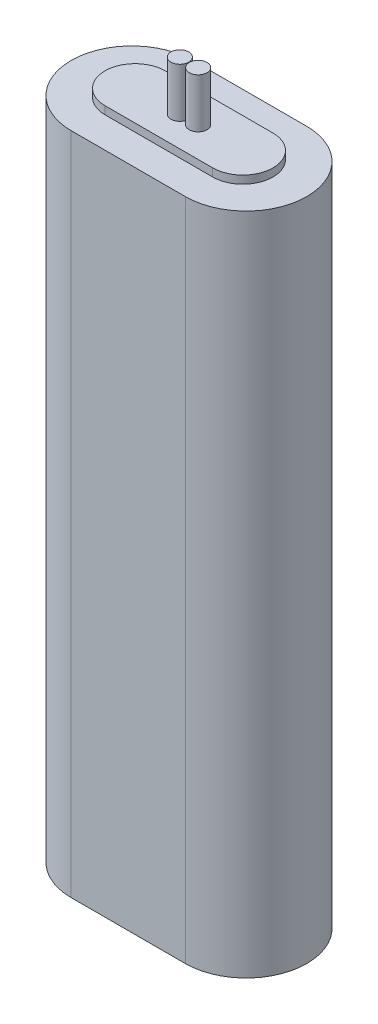
ISO-10303-21;
HEADER;
FILE_DESCRIPTION(('STEP AP214'),'2;1');
FILE_NAME('part.step','',(''),(''),'','','');
FILE_SCHEMA(('AUTOMOTIVE_DESIGN { 1 0 10303 214 1 1 1 1 }'));
ENDSEC;
DATA;
#1=APPLICATION_CONTEXT('core data for automotive mechanical design processes');
#2=APPLICATION_PROTOCOL_DEFINITION('international standard','automotive_design',2000,#1);
#3=PRODUCT_CONTEXT('',#1,'mechanical');
#4=PRODUCT('Part','Part','',(#3));
#5=PRODUCT_RELATED_PRODUCT_CATEGORY('part','',(#4));
#6=PRODUCT_DEFINITION_FORMATION('','',#4);
#7=PRODUCT_DEFINITION_CONTEXT('part definition',#1,'design');
#8=PRODUCT_DEFINITION('design','',#6,#7);
#9=PRODUCT_DEFINITION_SHAPE('','',#8);
#10=(LENGTH_UNIT() NAMED_UNIT(*) SI_UNIT(.MILLI.,.METRE.));
#11=(NAMED_UNIT(*) PLANE_ANGLE_UNIT() SI_UNIT($,.RADIAN.));
#12=(NAMED_UNIT(*) SI_UNIT($,.STERADIAN.) SOLID_ANGLE_UNIT());
#13=UNCERTAINTY_MEASURE_WITH_UNIT(LENGTH_MEASURE(1.E-05),#10,'distance_accuracy_value','');
#14=(GEOMETRIC_REPRESENTATION_CONTEXT(3) GLOBAL_UNCERTAINTY_ASSIGNED_CONTEXT((#13)) GLOBAL_UNIT_ASSIGNED_CONTEXT((#10,
#11,#12)) REPRESENTATION_CONTEXT('',''));
#15=CARTESIAN_POINT('',(0.,0.,0.));
#16=DIRECTION('',(0.,0.,1.));
#17=DIRECTION('',(1.,0.,0.));
#18=AXIS2_PLACEMENT_3D('',#15,#16,#17);
#19=CARTESIAN_POINT('',(-11.55,67.2,0.));
#20=DIRECTION('',(0.,-1.,0.));
#21=DIRECTION('',(0.,0.,-1.));
#22=AXIS2_PLACEMENT_3D('',#19,#20,#21);
#23=CYLINDRICAL_SURFACE('',#22,12.3);
#24=CARTESIAN_POINT('',(-11.55,-67.2,0.));
#25=DIRECTION('',(0.,1.,0.));
#26=DIRECTION('',(0.,0.,1.));
#27=AXIS2_PLACEMENT_3D('',#24,#25,#26);
#28=CIRCLE('',#27,12.3);
#29=CARTESIAN_POINT('',(-11.55,-67.2,-12.3));
#30=VERTEX_POINT('',#29);
#31=CARTESIAN_POINT('',(-11.55,-67.2,12.3));
#32=VERTEX_POINT('',#31);
#33=EDGE_CURVE('E118',#30,#32,#28,.T.);
#34=ORIENTED_EDGE('',*,*,#33,.T.);
#35=DIRECTION('',(0.,-1.,0.));
#36=VECTOR('',#35,1.);
#37=CARTESIAN_POINT('',(-11.55,67.2,12.3));
#38=LINE('',#37,#36);
#39=CARTESIAN_POINT('',(-11.55,67.2,12.3));
#40=VERTEX_POINT('',#39);
#41=EDGE_CURVE('E11',#40,#32,#38,.T.);
#42=ORIENTED_EDGE('',*,*,#41,.F.);
#43=CARTESIAN_POINT('',(-11.55,67.2,0.));
#44=DIRECTION('',(0.,1.,0.));
#45=DIRECTION('',(0.,0.,1.));
#46=AXIS2_PLACEMENT_3D('',#43,#44,#45);
#47=CIRCLE('',#46,12.3);
#48=CARTESIAN_POINT('',(-11.55,67.2,-12.3));
#49=VERTEX_POINT('',#48);
#50=EDGE_CURVE('E127',#49,#40,#47,.T.);
#51=ORIENTED_EDGE('',*,*,#50,.F.);
#52=DIRECTION('',(0.,-1.,0.));
#53=VECTOR('',#52,1.);
#54=CARTESIAN_POINT('',(-11.55,67.2,-12.3));
#55=LINE('',#54,#53);
#56=EDGE_CURVE('E136',#49,#30,#55,.T.);
#57=ORIENTED_EDGE('',*,*,#56,.T.);
#58=EDGE_LOOP('',(#34,#42,#51,#57));
#59=FACE_BOUND('',#58,.T.);
#60=ADVANCED_FACE('F34',(#59),#23,.T.);
#61=CARTESIAN_POINT('',(-11.55,67.2,12.3));
#62=DIRECTION('',(0.,0.,-1.));
#63=DIRECTION('',(-1.,0.,0.));
#64=AXIS2_PLACEMENT_3D('',#61,#62,#63);
#65=PLANE('',#64);
#66=DIRECTION('',(1.,0.,0.));
#67=VECTOR('',#66,1.);
#68=CARTESIAN_POINT('',(-11.55,-67.2,12.3));
#69=LINE('',#68,#67);
#70=CARTESIAN_POINT('',(11.55,-67.2,12.3));
#71=VERTEX_POINT('',#70);
#72=EDGE_CURVE('E121',#32,#71,#69,.T.);
#73=ORIENTED_EDGE('',*,*,#72,.T.);
#74=DIRECTION('',(0.,-1.,0.));
#75=VECTOR('',#74,1.);
#76=CARTESIAN_POINT('',(11.55,67.2,12.3));
#77=LINE('',#76,#75);
#78=CARTESIAN_POINT('',(11.55,67.2,12.3));
#79=VERTEX_POINT('',#78);
#80=EDGE_CURVE('E41',#79,#71,#77,.T.);
#81=ORIENTED_EDGE('',*,*,#80,.F.);
#82=DIRECTION('',(1.,0.,0.));
#83=VECTOR('',#82,1.);
#84=CARTESIAN_POINT('',(-11.55,67.2,12.3));
#85=LINE('',#84,#83);
#86=EDGE_CURVE('E130',#40,#79,#85,.T.);
#87=ORIENTED_EDGE('',*,*,#86,.F.);
#88=ORIENTED_EDGE('',*,*,#41,.T.);
#89=EDGE_LOOP('',(#73,#81,#87,#88));
#90=FACE_BOUND('',#89,.T.);
#91=ADVANCED_FACE('F167',(#90),#65,.F.);
#92=CARTESIAN_POINT('',(11.55,67.2,0.));
#93=DIRECTION('',(0.,-1.,0.));
#94=DIRECTION('',(0.,0.,-1.));
#95=AXIS2_PLACEMENT_3D('',#92,#93,#94);
#96=CYLINDRICAL_SURFACE('',#95,12.3);
#97=CARTESIAN_POINT('',(11.55,-67.2,0.));
#98=DIRECTION('',(0.,1.,0.));
#99=DIRECTION('',(0.,0.,1.));
#100=AXIS2_PLACEMENT_3D('',#97,#98,#99);
#101=CIRCLE('',#100,12.3);
#102=CARTESIAN_POINT('',(11.55,-67.2,-12.3));
#103=VERTEX_POINT('',#102);
#104=EDGE_CURVE('E139',#71,#103,#101,.T.);
#105=ORIENTED_EDGE('',*,*,#104,.T.);
#106=DIRECTION('',(0.,-1.,0.));
#107=VECTOR('',#106,1.);
#108=CARTESIAN_POINT('',(11.55,67.2,-12.3));
#109=LINE('',#108,#107);
#110=CARTESIAN_POINT('',(11.55,67.2,-12.3));
#111=VERTEX_POINT('',#110);
#112=EDGE_CURVE('E144',#111,#103,#109,.T.);
#113=ORIENTED_EDGE('',*,*,#112,.F.);
#114=CARTESIAN_POINT('',(11.55,67.2,0.));
#115=DIRECTION('',(0.,1.,0.));
#116=DIRECTION('',(0.,0.,1.));
#117=AXIS2_PLACEMENT_3D('',#114,#115,#116);
#118=CIRCLE('',#117,12.3);
#119=EDGE_CURVE('E133',#79,#111,#118,.T.);
#120=ORIENTED_EDGE('',*,*,#119,.F.);
#121=ORIENTED_EDGE('',*,*,#80,.T.);
#122=EDGE_LOOP('',(#105,#113,#120,#121));
#123=FACE_BOUND('',#122,.T.);
#124=ADVANCED_FACE('F151',(#123),#96,.T.);
#125=CARTESIAN_POINT('',(-11.55,67.2,-12.3));
#126=DIRECTION('',(0.,0.,1.));
#127=DIRECTION('',(1.,0.,0.));
#128=AXIS2_PLACEMENT_3D('',#125,#126,#127);
#129=PLANE('',#128);
#130=DIRECTION('',(-1.,0.,0.));
#131=VECTOR('',#130,1.);
#132=CARTESIAN_POINT('',(-11.55,-67.2,-12.3));
#133=LINE('',#132,#131);
#134=EDGE_CURVE('E131',#103,#30,#133,.T.);
#135=ORIENTED_EDGE('',*,*,#134,.T.);
#136=ORIENTED_EDGE('',*,*,#56,.F.);
#137=DIRECTION('',(-1.,0.,0.));
#138=VECTOR('',#137,1.);
#139=CARTESIAN_POINT('',(-11.55,67.2,-12.3));
#140=LINE('',#139,#138);
#141=EDGE_CURVE('E135',#111,#49,#140,.T.);
#142=ORIENTED_EDGE('',*,*,#141,.F.);
#143=ORIENTED_EDGE('',*,*,#112,.T.);
#144=EDGE_LOOP('',(#135,#136,#142,#143));
#145=FACE_BOUND('',#144,.T.);
#146=ADVANCED_FACE('F160',(#145),#129,.F.);
#147=CARTESIAN_POINT('',(-11.55,67.2,0.));
#148=DIRECTION('',(0.,1.,0.));
#149=DIRECTION('',(0.,0.,1.));
#150=AXIS2_PLACEMENT_3D('',#147,#148,#149);
#151=PLANE('',#150);
#152=CARTESIAN_POINT('',(-10.9,67.2,0.));
#153=DIRECTION('',(0.,1.,0.));
#154=DIRECTION('',(0.,0.,1.));
#155=AXIS2_PLACEMENT_3D('',#152,#153,#154);
#156=CIRCLE('',#155,6.1);
#157=CARTESIAN_POINT('',(-10.9,67.2,-6.1));
#158=VERTEX_POINT('',#157);
#159=CARTESIAN_POINT('',(-10.9,67.2,6.1));
#160=VERTEX_POINT('',#159);
#161=EDGE_CURVE('E48',#158,#160,#156,.T.);
#162=ORIENTED_EDGE('',*,*,#161,.F.);
#163=DIRECTION('',(-1.,0.,0.));
#164=VECTOR('',#163,1.);
#165=CARTESIAN_POINT('',(-10.9,67.2,-6.1));
#166=LINE('',#165,#164);
#167=CARTESIAN_POINT('',(10.9,67.2,-6.1));
#168=VERTEX_POINT('',#167);
#169=EDGE_CURVE('E52',#168,#158,#166,.T.);
#170=ORIENTED_EDGE('',*,*,#169,.F.);
#171=CARTESIAN_POINT('',(10.9,67.2,0.));
#172=DIRECTION('',(0.,1.,0.));
#173=DIRECTION('',(0.,0.,1.));
#174=AXIS2_PLACEMENT_3D('',#171,#172,#173);
#175=CIRCLE('',#174,6.1);
#176=CARTESIAN_POINT('',(10.9,67.2,6.1));
#177=VERTEX_POINT('',#176);
#178=EDGE_CURVE('E233',#177,#168,#175,.T.);
#179=ORIENTED_EDGE('',*,*,#178,.F.);
#180=DIRECTION('',(1.,0.,0.));
#181=VECTOR('',#180,1.);
#182=CARTESIAN_POINT('',(-10.9,67.2,6.1));
#183=LINE('',#182,#181);
#184=EDGE_CURVE('E231',#160,#177,#183,.T.);
#185=ORIENTED_EDGE('',*,*,#184,.F.);
#186=EDGE_LOOP('',(#162,#170,#179,#185));
#187=FACE_BOUND('',#186,.T.);
#188=ORIENTED_EDGE('',*,*,#50,.T.);
#189=ORIENTED_EDGE('',*,*,#86,.T.);
#190=ORIENTED_EDGE('',*,*,#119,.T.);
#191=ORIENTED_EDGE('',*,*,#141,.T.);
#192=EDGE_LOOP('',(#188,#189,#190,#191));
#193=FACE_BOUND('',#192,.T.);
#194=ADVANCED_FACE('F166',(#187,#193),#151,.T.);
#195=CARTESIAN_POINT('',(-11.55,-67.2,0.));
#196=DIRECTION('',(0.,1.,0.));
#197=DIRECTION('',(0.,0.,1.));
#198=AXIS2_PLACEMENT_3D('',#195,#196,#197);
#199=PLANE('',#198);
#200=ORIENTED_EDGE('',*,*,#33,.F.);
#201=ORIENTED_EDGE('',*,*,#134,.F.);
#202=ORIENTED_EDGE('',*,*,#104,.F.);
#203=ORIENTED_EDGE('',*,*,#72,.F.);
#204=EDGE_LOOP('',(#200,#201,#202,#203));
#205=FACE_BOUND('',#204,.T.);
#206=ADVANCED_FACE('F157',(#205),#199,.F.);
#207=CARTESIAN_POINT('',(-10.9,68.8,0.));
#208=DIRECTION('',(0.,-1.,0.));
#209=DIRECTION('',(0.,0.,-1.));
#210=AXIS2_PLACEMENT_3D('',#207,#208,#209);
#211=CYLINDRICAL_SURFACE('',#210,6.1);
#212=ORIENTED_EDGE('',*,*,#161,.T.);
#213=DIRECTION('',(0.,-1.,0.));
#214=VECTOR('',#213,1.);
#215=CARTESIAN_POINT('',(-10.9,68.8,6.1));
#216=LINE('',#215,#214);
#217=CARTESIAN_POINT('',(-10.9,68.8,6.1));
#218=VERTEX_POINT('',#217);
#219=EDGE_CURVE('E101',#218,#160,#216,.T.);
#220=ORIENTED_EDGE('',*,*,#219,.F.);
#221=CARTESIAN_POINT('',(-10.9,68.8,0.));
#222=DIRECTION('',(0.,1.,0.));
#223=DIRECTION('',(0.,0.,1.));
#224=AXIS2_PLACEMENT_3D('',#221,#222,#223);
#225=CIRCLE('',#224,6.1);
#226=CARTESIAN_POINT('',(-10.9,68.8,-6.1));
#227=VERTEX_POINT('',#226);
#228=EDGE_CURVE('E107',#227,#218,#225,.T.);
#229=ORIENTED_EDGE('',*,*,#228,.F.);
#230=DIRECTION('',(0.,-1.,0.));
#231=VECTOR('',#230,1.);
#232=CARTESIAN_POINT('',(-10.9,68.8,-6.1));
#233=LINE('',#232,#231);
#234=EDGE_CURVE('E229',#227,#158,#233,.T.);
#235=ORIENTED_EDGE('',*,*,#234,.T.);
#236=EDGE_LOOP('',(#212,#220,#229,#235));
#237=FACE_BOUND('',#236,.T.);
#238=ADVANCED_FACE('F117',(#237),#211,.T.);
#239=CARTESIAN_POINT('',(-10.9,68.8,6.1));
#240=DIRECTION('',(0.,0.,-1.));
#241=DIRECTION('',(-1.,0.,0.));
#242=AXIS2_PLACEMENT_3D('',#239,#240,#241);
#243=PLANE('',#242);
#244=ORIENTED_EDGE('',*,*,#184,.T.);
#245=DIRECTION('',(0.,-1.,0.));
#246=VECTOR('',#245,1.);
#247=CARTESIAN_POINT('',(10.9,68.8,6.1));
#248=LINE('',#247,#246);
#249=CARTESIAN_POINT('',(10.9,68.8,6.1));
#250=VERTEX_POINT('',#249);
#251=EDGE_CURVE('E103',#250,#177,#248,.T.);
#252=ORIENTED_EDGE('',*,*,#251,.F.);
#253=DIRECTION('',(1.,0.,0.));
#254=VECTOR('',#253,1.);
#255=CARTESIAN_POINT('',(-10.9,68.8,6.1));
#256=LINE('',#255,#254);
#257=EDGE_CURVE('E96',#218,#250,#256,.T.);
#258=ORIENTED_EDGE('',*,*,#257,.F.);
#259=ORIENTED_EDGE('',*,*,#219,.T.);
#260=EDGE_LOOP('',(#244,#252,#258,#259));
#261=FACE_BOUND('',#260,.T.);
#262=ADVANCED_FACE('F99',(#261),#243,.F.);
#263=CARTESIAN_POINT('',(10.9,68.8,0.));
#264=DIRECTION('',(0.,-1.,0.));
#265=DIRECTION('',(0.,0.,-1.));
#266=AXIS2_PLACEMENT_3D('',#263,#264,#265);
#267=CYLINDRICAL_SURFACE('',#266,6.1);
#268=ORIENTED_EDGE('',*,*,#178,.T.);
#269=DIRECTION('',(0.,-1.,0.));
#270=VECTOR('',#269,1.);
#271=CARTESIAN_POINT('',(10.9,68.8,-6.1));
#272=LINE('',#271,#270);
#273=CARTESIAN_POINT('',(10.9,68.8,-6.1));
#274=VERTEX_POINT('',#273);
#275=EDGE_CURVE('E123',#274,#168,#272,.T.);
#276=ORIENTED_EDGE('',*,*,#275,.F.);
#277=CARTESIAN_POINT('',(10.9,68.8,0.));
#278=DIRECTION('',(0.,1.,0.));
#279=DIRECTION('',(0.,0.,1.));
#280=AXIS2_PLACEMENT_3D('',#277,#278,#279);
#281=CIRCLE('',#280,6.1);
#282=EDGE_CURVE('E106',#250,#274,#281,.T.);
#283=ORIENTED_EDGE('',*,*,#282,.F.);
#284=ORIENTED_EDGE('',*,*,#251,.T.);
#285=EDGE_LOOP('',(#268,#276,#283,#284));
#286=FACE_BOUND('',#285,.T.);
#287=ADVANCED_FACE('F185',(#286),#267,.T.);
#288=CARTESIAN_POINT('',(-10.9,68.8,-6.1));
#289=DIRECTION('',(0.,0.,1.));
#290=DIRECTION('',(1.,0.,0.));
#291=AXIS2_PLACEMENT_3D('',#288,#289,#290);
#292=PLANE('',#291);
#293=ORIENTED_EDGE('',*,*,#169,.T.);
#294=ORIENTED_EDGE('',*,*,#234,.F.);
#295=DIRECTION('',(-1.,0.,0.));
#296=VECTOR('',#295,1.);
#297=CARTESIAN_POINT('',(-10.9,68.8,-6.1));
#298=LINE('',#297,#296);
#299=EDGE_CURVE('E112',#274,#227,#298,.T.);
#300=ORIENTED_EDGE('',*,*,#299,.F.);
#301=ORIENTED_EDGE('',*,*,#275,.T.);
#302=EDGE_LOOP('',(#293,#294,#300,#301));
#303=FACE_BOUND('',#302,.T.);
#304=ADVANCED_FACE('F188',(#303),#292,.F.);
#305=CARTESIAN_POINT('',(-10.9,68.8,0.));
#306=DIRECTION('',(0.,1.,0.));
#307=DIRECTION('',(0.,0.,1.));
#308=AXIS2_PLACEMENT_3D('',#305,#306,#307);
#309=PLANE('',#308);
#310=CARTESIAN_POINT('',(1.85,68.8,0.));
#311=DIRECTION('',(0.,1.,0.));
#312=DIRECTION('',(0.,0.,-1.));
#313=AXIS2_PLACEMENT_3D('',#310,#311,#312);
#314=CIRCLE('',#313,1.8);
#315=CARTESIAN_POINT('',(1.85,68.8,-1.8));
#316=VERTEX_POINT('',#315);
#317=EDGE_CURVE('E217',#316,#316,#314,.T.);
#318=ORIENTED_EDGE('',*,*,#317,.F.);
#319=EDGE_LOOP('',(#318));
#320=FACE_BOUND('',#319,.T.);
#321=CARTESIAN_POINT('',(-1.85,68.8,0.));
#322=DIRECTION('',(0.,1.,0.));
#323=DIRECTION('',(0.,0.,1.));
#324=AXIS2_PLACEMENT_3D('',#321,#322,#323);
#325=CIRCLE('',#324,1.8);
#326=CARTESIAN_POINT('',(-1.85,68.8,1.8));
#327=VERTEX_POINT('',#326);
#328=EDGE_CURVE('E216',#327,#327,#325,.T.);
#329=ORIENTED_EDGE('',*,*,#328,.F.);
#330=EDGE_LOOP('',(#329));
#331=FACE_BOUND('',#330,.T.);
#332=ORIENTED_EDGE('',*,*,#228,.T.);
#333=ORIENTED_EDGE('',*,*,#257,.T.);
#334=ORIENTED_EDGE('',*,*,#282,.T.);
#335=ORIENTED_EDGE('',*,*,#299,.T.);
#336=EDGE_LOOP('',(#332,#333,#334,#335));
#337=FACE_BOUND('',#336,.T.);
#338=ADVANCED_FACE('F110',(#320,#331,#337),#309,.T.);
#339=CARTESIAN_POINT('',(-1.85,78.8,0.));
#340=DIRECTION('',(0.,-1.,0.));
#341=DIRECTION('',(0.,0.,-1.));
#342=AXIS2_PLACEMENT_3D('',#339,#340,#341);
#343=CYLINDRICAL_SURFACE('',#342,1.8);
#344=CARTESIAN_POINT('',(-1.85,78.8,0.));
#345=DIRECTION('',(0.,1.,0.));
#346=DIRECTION('',(0.,0.,1.));
#347=AXIS2_PLACEMENT_3D('',#344,#345,#346);
#348=CIRCLE('',#347,1.8);
#349=CARTESIAN_POINT('',(-1.85,78.8,1.8));
#350=VERTEX_POINT('',#349);
#351=EDGE_CURVE('E220',#350,#350,#348,.T.);
#352=ORIENTED_EDGE('',*,*,#351,.F.);
#353=EDGE_LOOP('',(#352));
#354=FACE_BOUND('',#353,.T.);
#355=ORIENTED_EDGE('',*,*,#328,.T.);
#356=EDGE_LOOP('',(#355));
#357=FACE_BOUND('',#356,.T.);
#358=ADVANCED_FACE('F195',(#354,#357),#343,.T.);
#359=CARTESIAN_POINT('',(-1.85,78.8,0.));
#360=DIRECTION('',(0.,1.,0.));
#361=DIRECTION('',(0.,0.,1.));
#362=AXIS2_PLACEMENT_3D('',#359,#360,#361);
#363=PLANE('',#362);
#364=ORIENTED_EDGE('',*,*,#351,.T.);
#365=EDGE_LOOP('',(#364));
#366=FACE_BOUND('',#365,.T.);
#367=ADVANCED_FACE('F199',(#366),#363,.T.);
#368=CARTESIAN_POINT('',(1.85,78.8,0.));
#369=DIRECTION('',(0.,-1.,0.));
#370=DIRECTION('',(0.,0.,-1.));
#371=AXIS2_PLACEMENT_3D('',#368,#369,#370);
#372=CYLINDRICAL_SURFACE('',#371,1.8);
#373=CARTESIAN_POINT('',(1.85,78.8,0.));
#374=DIRECTION('',(0.,1.,0.));
#375=DIRECTION('',(0.,0.,-1.));
#376=AXIS2_PLACEMENT_3D('',#373,#374,#375);
#377=CIRCLE('',#376,1.8);
#378=CARTESIAN_POINT('',(1.85,78.8,-1.8));
#379=VERTEX_POINT('',#378);
#380=EDGE_CURVE('E215',#379,#379,#377,.T.);
#381=ORIENTED_EDGE('',*,*,#380,.F.);
#382=EDGE_LOOP('',(#381));
#383=FACE_BOUND('',#382,.T.);
#384=ORIENTED_EDGE('',*,*,#317,.T.);
#385=EDGE_LOOP('',(#384));
#386=FACE_BOUND('',#385,.T.);
#387=ADVANCED_FACE('F203',(#383,#386),#372,.T.);
#388=CARTESIAN_POINT('',(1.85,78.8,0.));
#389=DIRECTION('',(0.,-1.,0.));
#390=DIRECTION('',(0.,0.,-1.));
#391=AXIS2_PLACEMENT_3D('',#388,#389,#390);
#392=PLANE('',#391);
#393=ORIENTED_EDGE('',*,*,#380,.T.);
#394=EDGE_LOOP('',(#393));
#395=FACE_BOUND('',#394,.T.);
#396=ADVANCED_FACE('F207',(#395),#392,.F.);
#397=CLOSED_SHELL('',(#60,#91,#124,#146,#194,#206,#238,#262,#287,#304,#338,#358,#367,#387,#396));
#398=MANIFOLD_SOLID_BREP('B2',#397);
#399=ADVANCED_BREP_SHAPE_REPRESENTATION('',(#18,#398),#14);
#400=SHAPE_DEFINITION_REPRESENTATION(#9,#399);
ENDSEC;
END-ISO-10303-21;
